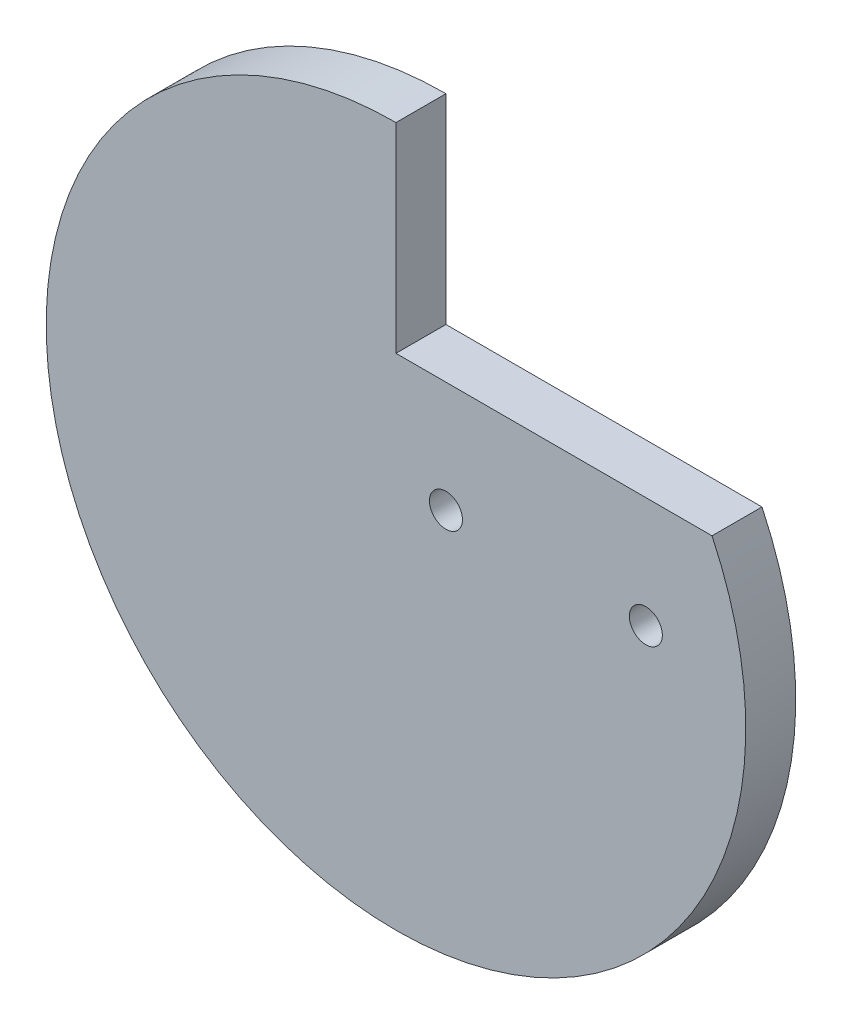
ISO-10303-21;
HEADER;
FILE_DESCRIPTION(('STEP AP214'),'2;1');
FILE_NAME('part.step','',(''),(''),'','','');
FILE_SCHEMA(('AUTOMOTIVE_DESIGN { 1 0 10303 214 1 1 1 1 }'));
ENDSEC;
DATA;
#1=APPLICATION_CONTEXT('core data for automotive mechanical design processes');
#2=APPLICATION_PROTOCOL_DEFINITION('international standard','automotive_design',2000,#1);
#3=PRODUCT_CONTEXT('',#1,'mechanical');
#4=PRODUCT('Part','Part','',(#3));
#5=PRODUCT_RELATED_PRODUCT_CATEGORY('part','',(#4));
#6=PRODUCT_DEFINITION_FORMATION('','',#4);
#7=PRODUCT_DEFINITION_CONTEXT('part definition',#1,'design');
#8=PRODUCT_DEFINITION('design','',#6,#7);
#9=PRODUCT_DEFINITION_SHAPE('','',#8);
#10=(LENGTH_UNIT() NAMED_UNIT(*) SI_UNIT(.MILLI.,.METRE.));
#11=(NAMED_UNIT(*) PLANE_ANGLE_UNIT() SI_UNIT($,.RADIAN.));
#12=(NAMED_UNIT(*) SI_UNIT($,.STERADIAN.) SOLID_ANGLE_UNIT());
#13=UNCERTAINTY_MEASURE_WITH_UNIT(LENGTH_MEASURE(1.E-05),#10,'distance_accuracy_value','');
#14=(GEOMETRIC_REPRESENTATION_CONTEXT(3) GLOBAL_UNCERTAINTY_ASSIGNED_CONTEXT((#13)) GLOBAL_UNIT_ASSIGNED_CONTEXT((#10,
#11,#12)) REPRESENTATION_CONTEXT('',''));
#15=CARTESIAN_POINT('',(0.,0.,0.));
#16=DIRECTION('',(0.,0.,1.));
#17=DIRECTION('',(1.,0.,0.));
#18=AXIS2_PLACEMENT_3D('',#15,#16,#17);
#19=CARTESIAN_POINT('',(0.,0.,5.));
#20=DIRECTION('',(0.,0.,-1.));
#21=DIRECTION('',(-1.,0.,0.));
#22=AXIS2_PLACEMENT_3D('',#19,#20,#21);
#23=CYLINDRICAL_SURFACE('',#22,35.);
#24=CARTESIAN_POINT('',(0.,0.,0.));
#25=DIRECTION('',(0.,0.,1.));
#26=DIRECTION('',(1.,0.,0.));
#27=AXIS2_PLACEMENT_3D('',#24,#25,#26);
#28=CIRCLE('',#27,35.);
#29=CARTESIAN_POINT('',(0.,35.,0.));
#30=VERTEX_POINT('',#29);
#31=CARTESIAN_POINT('',(31.6227766016838,15.,0.));
#32=VERTEX_POINT('',#31);
#33=EDGE_CURVE('E46',#30,#32,#28,.T.);
#34=ORIENTED_EDGE('',*,*,#33,.T.);
#35=DIRECTION('',(0.,0.,-1.));
#36=VECTOR('',#35,1.);
#37=CARTESIAN_POINT('',(31.6227766016838,15.,5.));
#38=LINE('',#37,#36);
#39=CARTESIAN_POINT('',(31.6227766016838,15.,5.));
#40=VERTEX_POINT('',#39);
#41=EDGE_CURVE('E63',#32,#40,#38,.F.);
#42=ORIENTED_EDGE('',*,*,#41,.T.);
#43=CARTESIAN_POINT('',(0.,0.,5.));
#44=DIRECTION('',(0.,0.,1.));
#45=DIRECTION('',(1.,0.,0.));
#46=AXIS2_PLACEMENT_3D('',#43,#44,#45);
#47=CIRCLE('',#46,35.);
#48=CARTESIAN_POINT('',(0.,35.,5.));
#49=VERTEX_POINT('',#48);
#50=EDGE_CURVE('E11',#49,#40,#47,.T.);
#51=ORIENTED_EDGE('',*,*,#50,.F.);
#52=DIRECTION('',(0.,0.,1.));
#53=VECTOR('',#52,1.);
#54=CARTESIAN_POINT('',(0.,35.,0.));
#55=LINE('',#54,#53);
#56=EDGE_CURVE('E76',#30,#49,#55,.T.);
#57=ORIENTED_EDGE('',*,*,#56,.F.);
#58=EDGE_LOOP('',(#34,#42,#51,#57));
#59=FACE_BOUND('',#58,.T.);
#60=ADVANCED_FACE('F43',(#59),#23,.T.);
#61=CARTESIAN_POINT('',(0.,0.,5.));
#62=DIRECTION('',(0.,0.,1.));
#63=DIRECTION('',(1.,0.,0.));
#64=AXIS2_PLACEMENT_3D('',#61,#62,#63);
#65=PLANE('',#64);
#66=DIRECTION('',(1.,0.,0.));
#67=VECTOR('',#66,1.);
#68=CARTESIAN_POINT('',(0.,15.,5.));
#69=LINE('',#68,#67);
#70=CARTESIAN_POINT('',(0.,15.,5.));
#71=VERTEX_POINT('',#70);
#72=EDGE_CURVE('E93',#71,#40,#69,.T.);
#73=ORIENTED_EDGE('',*,*,#72,.F.);
#74=DIRECTION('',(0.,-1.,0.));
#75=VECTOR('',#74,1.);
#76=CARTESIAN_POINT('',(0.,35.,5.));
#77=LINE('',#76,#75);
#78=EDGE_CURVE('E79',#49,#71,#77,.T.);
#79=ORIENTED_EDGE('',*,*,#78,.F.);
#80=ORIENTED_EDGE('',*,*,#50,.T.);
#81=EDGE_LOOP('',(#73,#79,#80));
#82=FACE_BOUND('',#81,.T.);
#83=CARTESIAN_POINT('',(25.,3.9,5.));
#84=DIRECTION('',(0.,0.,1.));
#85=DIRECTION('',(1.,0.,0.));
#86=AXIS2_PLACEMENT_3D('',#83,#84,#85);
#87=CIRCLE('',#86,1.65);
#88=CARTESIAN_POINT('',(26.65,3.9,5.));
#89=VERTEX_POINT('',#88);
#90=EDGE_CURVE('E107',#89,#89,#87,.T.);
#91=ORIENTED_EDGE('',*,*,#90,.F.);
#92=EDGE_LOOP('',(#91));
#93=FACE_BOUND('',#92,.T.);
#94=CARTESIAN_POINT('',(5.,3.9,5.));
#95=DIRECTION('',(0.,0.,1.));
#96=DIRECTION('',(1.,0.,0.));
#97=AXIS2_PLACEMENT_3D('',#94,#95,#96);
#98=CIRCLE('',#97,1.65);
#99=CARTESIAN_POINT('',(6.65,3.9,5.));
#100=VERTEX_POINT('',#99);
#101=EDGE_CURVE('E102',#100,#100,#98,.T.);
#102=ORIENTED_EDGE('',*,*,#101,.F.);
#103=EDGE_LOOP('',(#102));
#104=FACE_BOUND('',#103,.T.);
#105=ADVANCED_FACE('F91',(#82,#93,#104),#65,.T.);
#106=CARTESIAN_POINT('',(0.,0.,0.));
#107=DIRECTION('',(0.,0.,1.));
#108=DIRECTION('',(1.,0.,0.));
#109=AXIS2_PLACEMENT_3D('',#106,#107,#108);
#110=PLANE('',#109);
#111=CARTESIAN_POINT('',(25.,3.9,0.));
#112=DIRECTION('',(0.,0.,1.));
#113=DIRECTION('',(1.,0.,0.));
#114=AXIS2_PLACEMENT_3D('',#111,#112,#113);
#115=CIRCLE('',#114,1.65);
#116=CARTESIAN_POINT('',(26.65,3.9,0.));
#117=VERTEX_POINT('',#116);
#118=EDGE_CURVE('E114',#117,#117,#115,.T.);
#119=ORIENTED_EDGE('',*,*,#118,.T.);
#120=EDGE_LOOP('',(#119));
#121=FACE_BOUND('',#120,.T.);
#122=CARTESIAN_POINT('',(5.,3.9,0.));
#123=DIRECTION('',(0.,0.,1.));
#124=DIRECTION('',(1.,0.,0.));
#125=AXIS2_PLACEMENT_3D('',#122,#123,#124);
#126=CIRCLE('',#125,1.65);
#127=CARTESIAN_POINT('',(6.65,3.9,0.));
#128=VERTEX_POINT('',#127);
#129=EDGE_CURVE('E97',#128,#128,#126,.T.);
#130=ORIENTED_EDGE('',*,*,#129,.T.);
#131=EDGE_LOOP('',(#130));
#132=FACE_BOUND('',#131,.T.);
#133=DIRECTION('',(0.,-1.,0.));
#134=VECTOR('',#133,1.);
#135=CARTESIAN_POINT('',(0.,35.,0.));
#136=LINE('',#135,#134);
#137=CARTESIAN_POINT('',(0.,15.,0.));
#138=VERTEX_POINT('',#137);
#139=EDGE_CURVE('E82',#30,#138,#136,.T.);
#140=ORIENTED_EDGE('',*,*,#139,.T.);
#141=DIRECTION('',(1.,0.,0.));
#142=VECTOR('',#141,1.);
#143=CARTESIAN_POINT('',(0.,15.,0.));
#144=LINE('',#143,#142);
#145=EDGE_CURVE('E58',#138,#32,#144,.T.);
#146=ORIENTED_EDGE('',*,*,#145,.T.);
#147=ORIENTED_EDGE('',*,*,#33,.F.);
#148=EDGE_LOOP('',(#140,#146,#147));
#149=FACE_BOUND('',#148,.T.);
#150=ADVANCED_FACE('F128',(#121,#132,#149),#110,.F.);
#151=CARTESIAN_POINT('',(5.,3.9,0.));
#152=DIRECTION('',(0.,0.,1.));
#153=DIRECTION('',(1.,0.,0.));
#154=AXIS2_PLACEMENT_3D('',#151,#152,#153);
#155=CYLINDRICAL_SURFACE('',#154,1.65);
#156=ORIENTED_EDGE('',*,*,#129,.F.);
#157=EDGE_LOOP('',(#156));
#158=FACE_BOUND('',#157,.T.);
#159=ORIENTED_EDGE('',*,*,#101,.T.);
#160=EDGE_LOOP('',(#159));
#161=FACE_BOUND('',#160,.T.);
#162=ADVANCED_FACE('F132',(#158,#161),#155,.F.);
#163=CARTESIAN_POINT('',(25.,3.9,0.));
#164=DIRECTION('',(0.,0.,1.));
#165=DIRECTION('',(1.,0.,0.));
#166=AXIS2_PLACEMENT_3D('',#163,#164,#165);
#167=CYLINDRICAL_SURFACE('',#166,1.65);
#168=ORIENTED_EDGE('',*,*,#118,.F.);
#169=EDGE_LOOP('',(#168));
#170=FACE_BOUND('',#169,.T.);
#171=ORIENTED_EDGE('',*,*,#90,.T.);
#172=EDGE_LOOP('',(#171));
#173=FACE_BOUND('',#172,.T.);
#174=ADVANCED_FACE('F125',(#170,#173),#167,.F.);
#175=CARTESIAN_POINT('',(0.,15.,0.));
#176=DIRECTION('',(0.,-1.,0.));
#177=DIRECTION('',(0.,0.,-1.));
#178=AXIS2_PLACEMENT_3D('',#175,#176,#177);
#179=PLANE('',#178);
#180=ORIENTED_EDGE('',*,*,#145,.F.);
#181=DIRECTION('',(0.,0.,1.));
#182=VECTOR('',#181,1.);
#183=CARTESIAN_POINT('',(0.,15.,0.));
#184=LINE('',#183,#182);
#185=EDGE_CURVE('E88',#138,#71,#184,.T.);
#186=ORIENTED_EDGE('',*,*,#185,.T.);
#187=ORIENTED_EDGE('',*,*,#72,.T.);
#188=ORIENTED_EDGE('',*,*,#41,.F.);
#189=EDGE_LOOP('',(#180,#186,#187,#188));
#190=FACE_BOUND('',#189,.T.);
#191=ADVANCED_FACE('F140',(#190),#179,.F.);
#192=CARTESIAN_POINT('',(0.,35.,0.));
#193=DIRECTION('',(-1.,0.,0.));
#194=DIRECTION('',(0.,0.,1.));
#195=AXIS2_PLACEMENT_3D('',#192,#193,#194);
#196=PLANE('',#195);
#197=ORIENTED_EDGE('',*,*,#78,.T.);
#198=ORIENTED_EDGE('',*,*,#185,.F.);
#199=ORIENTED_EDGE('',*,*,#139,.F.);
#200=ORIENTED_EDGE('',*,*,#56,.T.);
#201=EDGE_LOOP('',(#197,#198,#199,#200));
#202=FACE_BOUND('',#201,.T.);
#203=ADVANCED_FACE('F78',(#202),#196,.F.);
#204=CLOSED_SHELL('',(#60,#105,#150,#162,#174,#191,#203));
#205=MANIFOLD_SOLID_BREP('B2',#204);
#206=ADVANCED_BREP_SHAPE_REPRESENTATION('',(#18,#205),#14);
#207=SHAPE_DEFINITION_REPRESENTATION(#9,#206);
ENDSEC;
END-ISO-10303-21;
